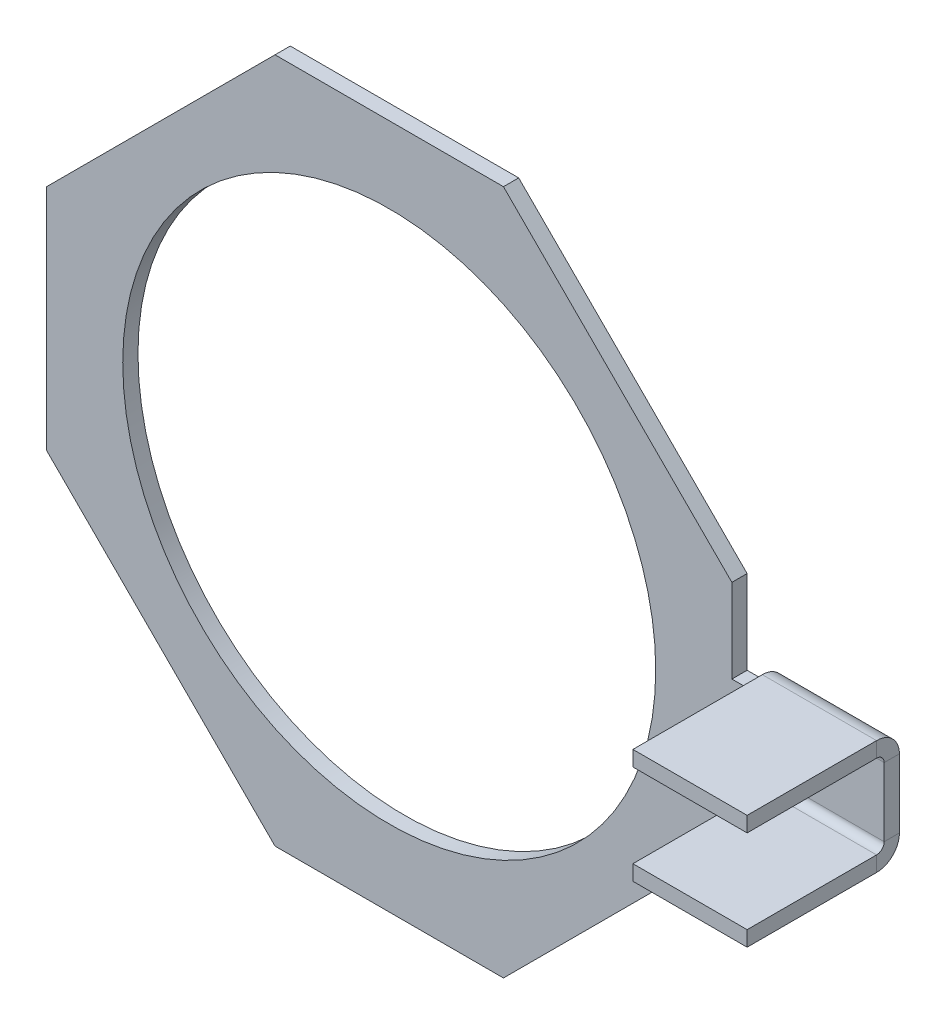
ISO-10303-21;
HEADER;
FILE_DESCRIPTION(('STEP AP214'),'2;1');
FILE_NAME('part.step','',(''),(''),'','','');
FILE_SCHEMA(('AUTOMOTIVE_DESIGN { 1 0 10303 214 1 1 1 1 }'));
ENDSEC;
DATA;
#1=APPLICATION_CONTEXT('core data for automotive mechanical design processes');
#2=APPLICATION_PROTOCOL_DEFINITION('international standard','automotive_design',2000,#1);
#3=PRODUCT_CONTEXT('',#1,'mechanical');
#4=PRODUCT('Part','Part','',(#3));
#5=PRODUCT_RELATED_PRODUCT_CATEGORY('part','',(#4));
#6=PRODUCT_DEFINITION_FORMATION('','',#4);
#7=PRODUCT_DEFINITION_CONTEXT('part definition',#1,'design');
#8=PRODUCT_DEFINITION('design','',#6,#7);
#9=PRODUCT_DEFINITION_SHAPE('','',#8);
#10=(LENGTH_UNIT() NAMED_UNIT(*) SI_UNIT(.MILLI.,.METRE.));
#11=(NAMED_UNIT(*) PLANE_ANGLE_UNIT() SI_UNIT($,.RADIAN.));
#12=(NAMED_UNIT(*) SI_UNIT($,.STERADIAN.) SOLID_ANGLE_UNIT());
#13=UNCERTAINTY_MEASURE_WITH_UNIT(LENGTH_MEASURE(1.E-05),#10,'distance_accuracy_value','');
#14=(GEOMETRIC_REPRESENTATION_CONTEXT(3) GLOBAL_UNCERTAINTY_ASSIGNED_CONTEXT((#13)) GLOBAL_UNIT_ASSIGNED_CONTEXT((#10,
#11,#12)) REPRESENTATION_CONTEXT('',''));
#15=CARTESIAN_POINT('',(0.,0.,0.));
#16=DIRECTION('',(0.,0.,1.));
#17=DIRECTION('',(1.,0.,0.));
#18=AXIS2_PLACEMENT_3D('',#15,#16,#17);
#19=CARTESIAN_POINT('',(65.,-4.,2.));
#20=DIRECTION('',(0.,1.,0.));
#21=DIRECTION('',(0.,0.,1.));
#22=AXIS2_PLACEMENT_3D('',#19,#20,#21);
#23=PLANE('',#22);
#24=DIRECTION('',(0.,0.,-1.));
#25=VECTOR('',#24,1.);
#26=CARTESIAN_POINT('',(50.,-4.,2.));
#27=LINE('',#26,#25);
#28=CARTESIAN_POINT('',(50.,-4.,2.));
#29=VERTEX_POINT('',#28);
#30=CARTESIAN_POINT('',(50.,-4.,0.));
#31=VERTEX_POINT('',#30);
#32=EDGE_CURVE('E352',#29,#31,#27,.T.);
#33=ORIENTED_EDGE('',*,*,#32,.F.);
#34=DIRECTION('',(-1.,0.,0.));
#35=VECTOR('',#34,1.);
#36=CARTESIAN_POINT('',(65.,-4.,2.));
#37=LINE('',#36,#35);
#38=CARTESIAN_POINT('',(45.,-4.,2.));
#39=VERTEX_POINT('',#38);
#40=EDGE_CURVE('E98',#29,#39,#37,.T.);
#41=ORIENTED_EDGE('',*,*,#40,.T.);
#42=DIRECTION('',(0.,0.,-1.));
#43=VECTOR('',#42,1.);
#44=CARTESIAN_POINT('',(45.,-4.,2.));
#45=LINE('',#44,#43);
#46=CARTESIAN_POINT('',(45.,-4.,0.));
#47=VERTEX_POINT('',#46);
#48=EDGE_CURVE('E371',#39,#47,#45,.T.);
#49=ORIENTED_EDGE('',*,*,#48,.T.);
#50=DIRECTION('',(-1.,0.,0.));
#51=VECTOR('',#50,1.);
#52=CARTESIAN_POINT('',(65.,-4.,0.));
#53=LINE('',#52,#51);
#54=EDGE_CURVE('E393',#31,#47,#53,.T.);
#55=ORIENTED_EDGE('',*,*,#54,.F.);
#56=EDGE_LOOP('',(#33,#41,#49,#55));
#57=FACE_BOUND('',#56,.T.);
#58=ADVANCED_FACE('F73',(#57),#23,.F.);
#59=CARTESIAN_POINT('',(45.,-15.,2.));
#60=DIRECTION('',(-1.,0.,0.));
#61=DIRECTION('',(0.,0.,1.));
#62=AXIS2_PLACEMENT_3D('',#59,#60,#61);
#63=PLANE('',#62);
#64=DIRECTION('',(0.,0.,1.));
#65=VECTOR('',#64,1.);
#66=CARTESIAN_POINT('',(45.,4.,2.));
#67=LINE('',#66,#65);
#68=CARTESIAN_POINT('',(45.,4.,0.));
#69=VERTEX_POINT('',#68);
#70=CARTESIAN_POINT('',(45.,4.,2.));
#71=VERTEX_POINT('',#70);
#72=EDGE_CURVE('E375',#69,#71,#67,.T.);
#73=ORIENTED_EDGE('',*,*,#72,.F.);
#74=DIRECTION('',(0.,1.,0.));
#75=VECTOR('',#74,1.);
#76=CARTESIAN_POINT('',(45.,-15.,0.));
#77=LINE('',#76,#75);
#78=CARTESIAN_POINT('',(45.,15.,0.));
#79=VERTEX_POINT('',#78);
#80=EDGE_CURVE('E411',#69,#79,#77,.T.);
#81=ORIENTED_EDGE('',*,*,#80,.T.);
#82=DIRECTION('',(0.,0.,-1.));
#83=VECTOR('',#82,1.);
#84=CARTESIAN_POINT('',(45.,15.,2.));
#85=LINE('',#84,#83);
#86=CARTESIAN_POINT('',(45.,15.,2.));
#87=VERTEX_POINT('',#86);
#88=EDGE_CURVE('E449',#87,#79,#85,.T.);
#89=ORIENTED_EDGE('',*,*,#88,.F.);
#90=DIRECTION('',(0.,1.,0.));
#91=VECTOR('',#90,1.);
#92=CARTESIAN_POINT('',(45.,-15.,2.));
#93=LINE('',#92,#91);
#94=EDGE_CURVE('E385',#71,#87,#93,.T.);
#95=ORIENTED_EDGE('',*,*,#94,.F.);
#96=EDGE_LOOP('',(#73,#81,#89,#95));
#97=FACE_BOUND('',#96,.T.);
#98=ADVANCED_FACE('F409',(#97),#63,.F.);
#99=ORIENTED_EDGE('',*,*,#48,.F.);
#100=CARTESIAN_POINT('',(45.,-15.,2.));
#101=VERTEX_POINT('',#100);
#102=EDGE_CURVE('E428',#101,#39,#93,.T.);
#103=ORIENTED_EDGE('',*,*,#102,.F.);
#104=DIRECTION('',(0.,0.,-1.));
#105=VECTOR('',#104,1.);
#106=CARTESIAN_POINT('',(45.,-15.,2.));
#107=LINE('',#106,#105);
#108=CARTESIAN_POINT('',(45.,-15.,0.));
#109=VERTEX_POINT('',#108);
#110=EDGE_CURVE('E451',#101,#109,#107,.T.);
#111=ORIENTED_EDGE('',*,*,#110,.T.);
#112=EDGE_CURVE('E420',#109,#47,#77,.T.);
#113=ORIENTED_EDGE('',*,*,#112,.T.);
#114=EDGE_LOOP('',(#99,#103,#111,#113));
#115=FACE_BOUND('',#114,.T.);
#116=ADVANCED_FACE('F499',(#115),#63,.F.);
#117=CARTESIAN_POINT('',(-45.,-15.,2.));
#118=DIRECTION('',(1.,0.,0.));
#119=DIRECTION('',(0.,0.,-1.));
#120=AXIS2_PLACEMENT_3D('',#117,#118,#119);
#121=PLANE('',#120);
#122=DIRECTION('',(0.,-1.,0.));
#123=VECTOR('',#122,1.);
#124=CARTESIAN_POINT('',(-45.,-15.,0.));
#125=LINE('',#124,#123);
#126=CARTESIAN_POINT('',(-45.,15.,0.));
#127=VERTEX_POINT('',#126);
#128=CARTESIAN_POINT('',(-45.,-15.,0.));
#129=VERTEX_POINT('',#128);
#130=EDGE_CURVE('E400',#127,#129,#125,.T.);
#131=ORIENTED_EDGE('',*,*,#130,.T.);
#132=DIRECTION('',(0.,0.,-1.));
#133=VECTOR('',#132,1.);
#134=CARTESIAN_POINT('',(-45.,-15.,2.));
#135=LINE('',#134,#133);
#136=CARTESIAN_POINT('',(-45.,-15.,2.));
#137=VERTEX_POINT('',#136);
#138=EDGE_CURVE('E13',#137,#129,#135,.T.);
#139=ORIENTED_EDGE('',*,*,#138,.F.);
#140=DIRECTION('',(0.,-1.,0.));
#141=VECTOR('',#140,1.);
#142=CARTESIAN_POINT('',(-45.,-15.,2.));
#143=LINE('',#142,#141);
#144=CARTESIAN_POINT('',(-45.,15.,2.));
#145=VERTEX_POINT('',#144);
#146=EDGE_CURVE('E438',#145,#137,#143,.T.);
#147=ORIENTED_EDGE('',*,*,#146,.F.);
#148=DIRECTION('',(0.,0.,-1.));
#149=VECTOR('',#148,1.);
#150=CARTESIAN_POINT('',(-45.,15.,2.));
#151=LINE('',#150,#149);
#152=EDGE_CURVE('E439',#145,#127,#151,.T.);
#153=ORIENTED_EDGE('',*,*,#152,.T.);
#154=EDGE_LOOP('',(#131,#139,#147,#153));
#155=FACE_BOUND('',#154,.T.);
#156=ADVANCED_FACE('F75',(#155),#121,.F.);
#157=CARTESIAN_POINT('',(-45.,-15.,2.));
#158=DIRECTION('',(0.707106781186547,0.707106781186547,0.));
#159=DIRECTION('',(-0.707106781186548,0.707106781186548,0.));
#160=AXIS2_PLACEMENT_3D('',#157,#158,#159);
#161=PLANE('',#160);
#162=DIRECTION('',(0.707106781186547,-0.707106781186547,0.));
#163=VECTOR('',#162,1.);
#164=CARTESIAN_POINT('',(-45.,-15.,0.));
#165=LINE('',#164,#163);
#166=CARTESIAN_POINT('',(-15.,-45.,0.));
#167=VERTEX_POINT('',#166);
#168=EDGE_CURVE('E467',#129,#167,#165,.T.);
#169=ORIENTED_EDGE('',*,*,#168,.T.);
#170=DIRECTION('',(0.,0.,-1.));
#171=VECTOR('',#170,1.);
#172=CARTESIAN_POINT('',(-15.,-45.,2.));
#173=LINE('',#172,#171);
#174=CARTESIAN_POINT('',(-15.,-45.,2.));
#175=VERTEX_POINT('',#174);
#176=EDGE_CURVE('E82',#175,#167,#173,.T.);
#177=ORIENTED_EDGE('',*,*,#176,.F.);
#178=DIRECTION('',(0.707106781186547,-0.707106781186547,0.));
#179=VECTOR('',#178,1.);
#180=CARTESIAN_POINT('',(-45.,-15.,2.));
#181=LINE('',#180,#179);
#182=EDGE_CURVE('E483',#137,#175,#181,.T.);
#183=ORIENTED_EDGE('',*,*,#182,.F.);
#184=ORIENTED_EDGE('',*,*,#138,.T.);
#185=EDGE_LOOP('',(#169,#177,#183,#184));
#186=FACE_BOUND('',#185,.T.);
#187=ADVANCED_FACE('F491',(#186),#161,.F.);
#188=CARTESIAN_POINT('',(-15.,-45.,2.));
#189=DIRECTION('',(0.,1.,0.));
#190=DIRECTION('',(-1.,0.,0.));
#191=AXIS2_PLACEMENT_3D('',#188,#189,#190);
#192=PLANE('',#191);
#193=DIRECTION('',(1.,0.,0.));
#194=VECTOR('',#193,1.);
#195=CARTESIAN_POINT('',(-15.,-45.,0.));
#196=LINE('',#195,#194);
#197=CARTESIAN_POINT('',(15.,-45.,0.));
#198=VERTEX_POINT('',#197);
#199=EDGE_CURVE('E425',#167,#198,#196,.T.);
#200=ORIENTED_EDGE('',*,*,#199,.T.);
#201=DIRECTION('',(0.,0.,-1.));
#202=VECTOR('',#201,1.);
#203=CARTESIAN_POINT('',(15.,-45.,2.));
#204=LINE('',#203,#202);
#205=CARTESIAN_POINT('',(15.,-45.,2.));
#206=VERTEX_POINT('',#205);
#207=EDGE_CURVE('E454',#206,#198,#204,.T.);
#208=ORIENTED_EDGE('',*,*,#207,.F.);
#209=DIRECTION('',(1.,0.,0.));
#210=VECTOR('',#209,1.);
#211=CARTESIAN_POINT('',(-15.,-45.,2.));
#212=LINE('',#211,#210);
#213=EDGE_CURVE('E464',#175,#206,#212,.T.);
#214=ORIENTED_EDGE('',*,*,#213,.F.);
#215=ORIENTED_EDGE('',*,*,#176,.T.);
#216=EDGE_LOOP('',(#200,#208,#214,#215));
#217=FACE_BOUND('',#216,.T.);
#218=ADVANCED_FACE('F462',(#217),#192,.F.);
#219=CARTESIAN_POINT('',(15.,-45.,2.));
#220=DIRECTION('',(-0.707106781186547,0.707106781186548,0.));
#221=DIRECTION('',(-0.707106781186548,-0.707106781186547,0.));
#222=AXIS2_PLACEMENT_3D('',#219,#220,#221);
#223=PLANE('',#222);
#224=DIRECTION('',(0.707106781186548,0.707106781186547,0.));
#225=VECTOR('',#224,1.);
#226=CARTESIAN_POINT('',(15.,-45.,0.));
#227=LINE('',#226,#225);
#228=EDGE_CURVE('E421',#198,#109,#227,.T.);
#229=ORIENTED_EDGE('',*,*,#228,.T.);
#230=ORIENTED_EDGE('',*,*,#110,.F.);
#231=DIRECTION('',(0.707106781186548,0.707106781186547,0.));
#232=VECTOR('',#231,1.);
#233=CARTESIAN_POINT('',(15.,-45.,2.));
#234=LINE('',#233,#232);
#235=EDGE_CURVE('E479',#206,#101,#234,.T.);
#236=ORIENTED_EDGE('',*,*,#235,.F.);
#237=ORIENTED_EDGE('',*,*,#207,.T.);
#238=EDGE_LOOP('',(#229,#230,#236,#237));
#239=FACE_BOUND('',#238,.T.);
#240=ADVANCED_FACE('F497',(#239),#223,.F.);
#241=CARTESIAN_POINT('',(15.,45.,2.));
#242=DIRECTION('',(-0.707106781186547,-0.707106781186548,0.));
#243=DIRECTION('',(0.707106781186548,-0.707106781186547,0.));
#244=AXIS2_PLACEMENT_3D('',#241,#242,#243);
#245=PLANE('',#244);
#246=DIRECTION('',(-0.707106781186548,0.707106781186547,0.));
#247=VECTOR('',#246,1.);
#248=CARTESIAN_POINT('',(15.,45.,0.));
#249=LINE('',#248,#247);
#250=CARTESIAN_POINT('',(15.,45.,0.));
#251=VERTEX_POINT('',#250);
#252=EDGE_CURVE('E419',#79,#251,#249,.T.);
#253=ORIENTED_EDGE('',*,*,#252,.T.);
#254=DIRECTION('',(0.,0.,-1.));
#255=VECTOR('',#254,1.);
#256=CARTESIAN_POINT('',(15.,45.,2.));
#257=LINE('',#256,#255);
#258=CARTESIAN_POINT('',(15.,45.,2.));
#259=VERTEX_POINT('',#258);
#260=EDGE_CURVE('E446',#259,#251,#257,.T.);
#261=ORIENTED_EDGE('',*,*,#260,.F.);
#262=DIRECTION('',(-0.707106781186548,0.707106781186547,0.));
#263=VECTOR('',#262,1.);
#264=CARTESIAN_POINT('',(15.,45.,2.));
#265=LINE('',#264,#263);
#266=EDGE_CURVE('E476',#87,#259,#265,.T.);
#267=ORIENTED_EDGE('',*,*,#266,.F.);
#268=ORIENTED_EDGE('',*,*,#88,.T.);
#269=EDGE_LOOP('',(#253,#261,#267,#268));
#270=FACE_BOUND('',#269,.T.);
#271=ADVANCED_FACE('F522',(#270),#245,.F.);
#272=CARTESIAN_POINT('',(-15.,45.,2.));
#273=DIRECTION('',(0.,-1.,0.));
#274=DIRECTION('',(1.,0.,0.));
#275=AXIS2_PLACEMENT_3D('',#272,#273,#274);
#276=PLANE('',#275);
#277=DIRECTION('',(-1.,0.,0.));
#278=VECTOR('',#277,1.);
#279=CARTESIAN_POINT('',(-15.,45.,0.));
#280=LINE('',#279,#278);
#281=CARTESIAN_POINT('',(-15.,45.,0.));
#282=VERTEX_POINT('',#281);
#283=EDGE_CURVE('E434',#251,#282,#280,.T.);
#284=ORIENTED_EDGE('',*,*,#283,.T.);
#285=DIRECTION('',(0.,0.,-1.));
#286=VECTOR('',#285,1.);
#287=CARTESIAN_POINT('',(-15.,45.,2.));
#288=LINE('',#287,#286);
#289=CARTESIAN_POINT('',(-15.,45.,2.));
#290=VERTEX_POINT('',#289);
#291=EDGE_CURVE('E442',#290,#282,#288,.T.);
#292=ORIENTED_EDGE('',*,*,#291,.F.);
#293=DIRECTION('',(-1.,0.,0.));
#294=VECTOR('',#293,1.);
#295=CARTESIAN_POINT('',(-15.,45.,2.));
#296=LINE('',#295,#294);
#297=EDGE_CURVE('E474',#259,#290,#296,.T.);
#298=ORIENTED_EDGE('',*,*,#297,.F.);
#299=ORIENTED_EDGE('',*,*,#260,.T.);
#300=EDGE_LOOP('',(#284,#292,#298,#299));
#301=FACE_BOUND('',#300,.T.);
#302=ADVANCED_FACE('F518',(#301),#276,.F.);
#303=CARTESIAN_POINT('',(-45.,15.,2.));
#304=DIRECTION('',(0.707106781186548,-0.707106781186547,0.));
#305=DIRECTION('',(0.707106781186547,0.707106781186548,0.));
#306=AXIS2_PLACEMENT_3D('',#303,#304,#305);
#307=PLANE('',#306);
#308=DIRECTION('',(-0.707106781186547,-0.707106781186548,0.));
#309=VECTOR('',#308,1.);
#310=CARTESIAN_POINT('',(-45.,15.,0.));
#311=LINE('',#310,#309);
#312=EDGE_CURVE('E436',#282,#127,#311,.T.);
#313=ORIENTED_EDGE('',*,*,#312,.T.);
#314=ORIENTED_EDGE('',*,*,#152,.F.);
#315=DIRECTION('',(-0.707106781186547,-0.707106781186548,0.));
#316=VECTOR('',#315,1.);
#317=CARTESIAN_POINT('',(-45.,15.,2.));
#318=LINE('',#317,#316);
#319=EDGE_CURVE('E443',#290,#145,#318,.T.);
#320=ORIENTED_EDGE('',*,*,#319,.F.);
#321=ORIENTED_EDGE('',*,*,#291,.T.);
#322=EDGE_LOOP('',(#313,#314,#320,#321));
#323=FACE_BOUND('',#322,.T.);
#324=ADVANCED_FACE('F511',(#323),#307,.F.);
#325=CARTESIAN_POINT('',(-45.,45.,2.));
#326=DIRECTION('',(0.,0.,-1.));
#327=DIRECTION('',(-1.,0.,0.));
#328=AXIS2_PLACEMENT_3D('',#325,#326,#327);
#329=PLANE('',#328);
#330=CARTESIAN_POINT('',(0.,0.,2.));
#331=DIRECTION('',(0.,0.,1.));
#332=DIRECTION('',(1.,0.,0.));
#333=AXIS2_PLACEMENT_3D('',#330,#331,#332);
#334=CIRCLE('',#333,35.);
#335=CARTESIAN_POINT('',(35.,0.,2.));
#336=VERTEX_POINT('',#335);
#337=EDGE_CURVE('E626',#336,#336,#334,.T.);
#338=ORIENTED_EDGE('',*,*,#337,.F.);
#339=EDGE_LOOP('',(#338));
#340=FACE_BOUND('',#339,.T.);
#341=ORIENTED_EDGE('',*,*,#146,.T.);
#342=ORIENTED_EDGE('',*,*,#182,.T.);
#343=ORIENTED_EDGE('',*,*,#213,.T.);
#344=ORIENTED_EDGE('',*,*,#235,.T.);
#345=ORIENTED_EDGE('',*,*,#102,.T.);
#346=ORIENTED_EDGE('',*,*,#40,.F.);
#347=DIRECTION('',(0.,1.,0.));
#348=VECTOR('',#347,1.);
#349=CARTESIAN_POINT('',(50.,-4.5,2.));
#350=LINE('',#349,#348);
#351=CARTESIAN_POINT('',(50.,-4.5,2.));
#352=VERTEX_POINT('',#351);
#353=EDGE_CURVE('E369',#352,#29,#350,.T.);
#354=ORIENTED_EDGE('',*,*,#353,.F.);
#355=DIRECTION('',(-1.,0.,0.));
#356=VECTOR('',#355,1.);
#357=CARTESIAN_POINT('',(65.,-4.5,2.));
#358=LINE('',#357,#356);
#359=CARTESIAN_POINT('',(65.,-4.5,2.));
#360=VERTEX_POINT('',#359);
#361=EDGE_CURVE('E356',#360,#352,#358,.T.);
#362=ORIENTED_EDGE('',*,*,#361,.F.);
#363=DIRECTION('',(0.,-1.,0.));
#364=VECTOR('',#363,1.);
#365=CARTESIAN_POINT('',(65.,4.,2.));
#366=LINE('',#365,#364);
#367=CARTESIAN_POINT('',(65.,4.5,2.));
#368=VERTEX_POINT('',#367);
#369=EDGE_CURVE('E372',#368,#360,#366,.T.);
#370=ORIENTED_EDGE('',*,*,#369,.F.);
#371=DIRECTION('',(-1.,0.,0.));
#372=VECTOR('',#371,1.);
#373=CARTESIAN_POINT('',(65.,4.5,2.));
#374=LINE('',#373,#372);
#375=CARTESIAN_POINT('',(50.,4.5,2.));
#376=VERTEX_POINT('',#375);
#377=EDGE_CURVE('E343',#368,#376,#374,.T.);
#378=ORIENTED_EDGE('',*,*,#377,.T.);
#379=DIRECTION('',(0.,-1.,0.));
#380=VECTOR('',#379,1.);
#381=CARTESIAN_POINT('',(50.,4.5,2.));
#382=LINE('',#381,#380);
#383=CARTESIAN_POINT('',(50.,4.,2.));
#384=VERTEX_POINT('',#383);
#385=EDGE_CURVE('E346',#376,#384,#382,.T.);
#386=ORIENTED_EDGE('',*,*,#385,.T.);
#387=DIRECTION('',(-1.,0.,0.));
#388=VECTOR('',#387,1.);
#389=CARTESIAN_POINT('',(65.,4.,2.));
#390=LINE('',#389,#388);
#391=EDGE_CURVE('E90',#384,#71,#390,.T.);
#392=ORIENTED_EDGE('',*,*,#391,.T.);
#393=ORIENTED_EDGE('',*,*,#94,.T.);
#394=ORIENTED_EDGE('',*,*,#266,.T.);
#395=ORIENTED_EDGE('',*,*,#297,.T.);
#396=ORIENTED_EDGE('',*,*,#319,.T.);
#397=EDGE_LOOP('',(#341,#342,#343,#344,#345,#346,#354,#362,#370,#378,#386,#392,#393,#394,#395,#396));
#398=FACE_BOUND('',#397,.T.);
#399=ADVANCED_FACE('F487',(#340,#398),#329,.F.);
#400=CARTESIAN_POINT('',(-45.,45.,0.));
#401=DIRECTION('',(0.,0.,-1.));
#402=DIRECTION('',(-1.,0.,0.));
#403=AXIS2_PLACEMENT_3D('',#400,#401,#402);
#404=PLANE('',#403);
#405=CARTESIAN_POINT('',(0.,0.,0.));
#406=DIRECTION('',(0.,0.,-1.));
#407=DIRECTION('',(-1.,0.,0.));
#408=AXIS2_PLACEMENT_3D('',#405,#406,#407);
#409=CIRCLE('',#408,35.);
#410=CARTESIAN_POINT('',(-35.,0.,0.));
#411=VERTEX_POINT('',#410);
#412=EDGE_CURVE('E77',#411,#411,#409,.T.);
#413=ORIENTED_EDGE('',*,*,#412,.F.);
#414=EDGE_LOOP('',(#413));
#415=FACE_BOUND('',#414,.T.);
#416=ORIENTED_EDGE('',*,*,#130,.F.);
#417=ORIENTED_EDGE('',*,*,#312,.F.);
#418=ORIENTED_EDGE('',*,*,#283,.F.);
#419=ORIENTED_EDGE('',*,*,#252,.F.);
#420=ORIENTED_EDGE('',*,*,#80,.F.);
#421=DIRECTION('',(-1.,0.,0.));
#422=VECTOR('',#421,1.);
#423=CARTESIAN_POINT('',(65.,4.,0.));
#424=LINE('',#423,#422);
#425=CARTESIAN_POINT('',(50.,4.,0.));
#426=VERTEX_POINT('',#425);
#427=EDGE_CURVE('E396',#426,#69,#424,.T.);
#428=ORIENTED_EDGE('',*,*,#427,.F.);
#429=DIRECTION('',(0.,-1.,0.));
#430=VECTOR('',#429,1.);
#431=CARTESIAN_POINT('',(50.,4.5,0.));
#432=LINE('',#431,#430);
#433=CARTESIAN_POINT('',(50.,4.5,0.));
#434=VERTEX_POINT('',#433);
#435=EDGE_CURVE('E350',#434,#426,#432,.T.);
#436=ORIENTED_EDGE('',*,*,#435,.F.);
#437=DIRECTION('',(1.,0.,0.));
#438=VECTOR('',#437,1.);
#439=CARTESIAN_POINT('',(65.,4.5,0.));
#440=LINE('',#439,#438);
#441=CARTESIAN_POINT('',(65.,4.5,0.));
#442=VERTEX_POINT('',#441);
#443=EDGE_CURVE('E337',#434,#442,#440,.T.);
#444=ORIENTED_EDGE('',*,*,#443,.T.);
#445=DIRECTION('',(0.,1.,0.));
#446=VECTOR('',#445,1.);
#447=CARTESIAN_POINT('',(65.,4.,0.));
#448=LINE('',#447,#446);
#449=CARTESIAN_POINT('',(65.,-4.5,0.));
#450=VERTEX_POINT('',#449);
#451=EDGE_CURVE('E374',#450,#442,#448,.T.);
#452=ORIENTED_EDGE('',*,*,#451,.F.);
#453=DIRECTION('',(1.,0.,0.));
#454=VECTOR('',#453,1.);
#455=CARTESIAN_POINT('',(65.,-4.5,0.));
#456=LINE('',#455,#454);
#457=CARTESIAN_POINT('',(50.,-4.5,0.));
#458=VERTEX_POINT('',#457);
#459=EDGE_CURVE('E362',#458,#450,#456,.T.);
#460=ORIENTED_EDGE('',*,*,#459,.F.);
#461=DIRECTION('',(0.,1.,0.));
#462=VECTOR('',#461,1.);
#463=CARTESIAN_POINT('',(50.,-4.5,0.));
#464=LINE('',#463,#462);
#465=EDGE_CURVE('E365',#458,#31,#464,.T.);
#466=ORIENTED_EDGE('',*,*,#465,.T.);
#467=ORIENTED_EDGE('',*,*,#54,.T.);
#468=ORIENTED_EDGE('',*,*,#112,.F.);
#469=ORIENTED_EDGE('',*,*,#228,.F.);
#470=ORIENTED_EDGE('',*,*,#199,.F.);
#471=ORIENTED_EDGE('',*,*,#168,.F.);
#472=EDGE_LOOP('',(#416,#417,#418,#419,#420,#428,#436,#444,#452,#460,#466,#467,#468,#469,#470,#471));
#473=FACE_BOUND('',#472,.T.);
#474=ADVANCED_FACE('F416',(#415,#473),#404,.T.);
#475=CARTESIAN_POINT('',(65.,4.,2.));
#476=DIRECTION('',(0.,-1.,0.));
#477=DIRECTION('',(0.,0.,-1.));
#478=AXIS2_PLACEMENT_3D('',#475,#476,#477);
#479=PLANE('',#478);
#480=ORIENTED_EDGE('',*,*,#391,.F.);
#481=DIRECTION('',(0.,0.,-1.));
#482=VECTOR('',#481,1.);
#483=CARTESIAN_POINT('',(50.,4.,2.));
#484=LINE('',#483,#482);
#485=EDGE_CURVE('E325',#384,#426,#484,.T.);
#486=ORIENTED_EDGE('',*,*,#485,.T.);
#487=ORIENTED_EDGE('',*,*,#427,.T.);
#488=ORIENTED_EDGE('',*,*,#72,.T.);
#489=EDGE_LOOP('',(#480,#486,#487,#488));
#490=FACE_BOUND('',#489,.T.);
#491=ADVANCED_FACE('F405',(#490),#479,.F.);
#492=CARTESIAN_POINT('',(65.,-4.,2.));
#493=DIRECTION('',(1.,0.,0.));
#494=DIRECTION('',(0.,0.,-1.));
#495=AXIS2_PLACEMENT_3D('',#492,#493,#494);
#496=PLANE('',#495);
#497=ORIENTED_EDGE('',*,*,#369,.T.);
#498=DIRECTION('',(0.,0.,1.));
#499=VECTOR('',#498,1.);
#500=CARTESIAN_POINT('',(65.,-4.5,2.));
#501=LINE('',#500,#499);
#502=EDGE_CURVE('E353',#450,#360,#501,.T.);
#503=ORIENTED_EDGE('',*,*,#502,.F.);
#504=ORIENTED_EDGE('',*,*,#451,.T.);
#505=DIRECTION('',(0.,0.,1.));
#506=VECTOR('',#505,1.);
#507=CARTESIAN_POINT('',(65.,4.5,2.));
#508=LINE('',#507,#506);
#509=EDGE_CURVE('E334',#442,#368,#508,.T.);
#510=ORIENTED_EDGE('',*,*,#509,.T.);
#511=EDGE_LOOP('',(#497,#503,#504,#510));
#512=FACE_BOUND('',#511,.T.);
#513=ADVANCED_FACE('F601',(#512),#496,.T.);
#514=CARTESIAN_POINT('',(50.,-4.5,2.));
#515=DIRECTION('',(1.,0.,0.));
#516=DIRECTION('',(0.,0.,-1.));
#517=AXIS2_PLACEMENT_3D('',#514,#515,#516);
#518=PLANE('',#517);
#519=ORIENTED_EDGE('',*,*,#32,.T.);
#520=ORIENTED_EDGE('',*,*,#465,.F.);
#521=DIRECTION('',(0.,0.,-1.));
#522=VECTOR('',#521,1.);
#523=CARTESIAN_POINT('',(50.,-4.5,2.));
#524=LINE('',#523,#522);
#525=EDGE_CURVE('E359',#352,#458,#524,.T.);
#526=ORIENTED_EDGE('',*,*,#525,.F.);
#527=ORIENTED_EDGE('',*,*,#353,.T.);
#528=EDGE_LOOP('',(#519,#520,#526,#527));
#529=FACE_BOUND('',#528,.T.);
#530=ADVANCED_FACE('F547',(#529),#518,.F.);
#531=CARTESIAN_POINT('',(50.,4.5,2.));
#532=DIRECTION('',(-1.,0.,0.));
#533=DIRECTION('',(0.,0.,1.));
#534=AXIS2_PLACEMENT_3D('',#531,#532,#533);
#535=PLANE('',#534);
#536=ORIENTED_EDGE('',*,*,#485,.F.);
#537=ORIENTED_EDGE('',*,*,#385,.F.);
#538=DIRECTION('',(0.,0.,-1.));
#539=VECTOR('',#538,1.);
#540=CARTESIAN_POINT('',(50.,4.5,2.));
#541=LINE('',#540,#539);
#542=EDGE_CURVE('E340',#376,#434,#541,.T.);
#543=ORIENTED_EDGE('',*,*,#542,.T.);
#544=ORIENTED_EDGE('',*,*,#435,.T.);
#545=EDGE_LOOP('',(#536,#537,#543,#544));
#546=FACE_BOUND('',#545,.T.);
#547=ADVANCED_FACE('F594',(#546),#535,.T.);
#548=CARTESIAN_POINT('',(50.,-4.5,3.));
#549=DIRECTION('',(-1.,0.,0.));
#550=DIRECTION('',(0.,0.,1.));
#551=AXIS2_PLACEMENT_3D('',#548,#549,#550);
#552=PLANE('',#551);
#553=DIRECTION('',(0.,1.,0.));
#554=VECTOR('',#553,1.);
#555=CARTESIAN_POINT('',(50.,-7.5,2.99999999999999));
#556=LINE('',#555,#554);
#557=CARTESIAN_POINT('',(50.,-5.5,2.99999999999999));
#558=VERTEX_POINT('',#557);
#559=CARTESIAN_POINT('',(50.,-7.5,2.99999999999999));
#560=VERTEX_POINT('',#559);
#561=EDGE_CURVE('E282',#558,#560,#556,.F.);
#562=ORIENTED_EDGE('',*,*,#561,.F.);
#563=CARTESIAN_POINT('',(50.,-4.5,3.));
#564=DIRECTION('',(1.,0.,0.));
#565=DIRECTION('',(0.,0.,-1.));
#566=AXIS2_PLACEMENT_3D('',#563,#564,#565);
#567=CIRCLE('',#566,1.);
#568=EDGE_CURVE('E329',#352,#558,#567,.F.);
#569=ORIENTED_EDGE('',*,*,#568,.F.);
#570=ORIENTED_EDGE('',*,*,#525,.T.);
#571=CARTESIAN_POINT('',(50.,-4.5,3.));
#572=DIRECTION('',(1.,0.,0.));
#573=DIRECTION('',(0.,0.,-1.));
#574=AXIS2_PLACEMENT_3D('',#571,#572,#573);
#575=CIRCLE('',#574,3.);
#576=EDGE_CURVE('E322',#458,#560,#575,.F.);
#577=ORIENTED_EDGE('',*,*,#576,.T.);
#578=EDGE_LOOP('',(#562,#569,#570,#577));
#579=FACE_BOUND('',#578,.T.);
#580=ADVANCED_FACE('F555',(#579),#552,.T.);
#581=CARTESIAN_POINT('',(65.,-4.5,3.));
#582=DIRECTION('',(-1.,0.,0.));
#583=DIRECTION('',(0.,0.,1.));
#584=AXIS2_PLACEMENT_3D('',#581,#582,#583);
#585=PLANE('',#584);
#586=CARTESIAN_POINT('',(65.,-4.5,3.));
#587=DIRECTION('',(1.,0.,0.));
#588=DIRECTION('',(0.,0.,-1.));
#589=AXIS2_PLACEMENT_3D('',#586,#587,#588);
#590=CIRCLE('',#589,1.);
#591=CARTESIAN_POINT('',(65.,-5.5,3.));
#592=VERTEX_POINT('',#591);
#593=EDGE_CURVE('E295',#592,#360,#590,.T.);
#594=ORIENTED_EDGE('',*,*,#593,.F.);
#595=DIRECTION('',(0.,1.,0.));
#596=VECTOR('',#595,1.);
#597=CARTESIAN_POINT('',(65.,-5.5,3.));
#598=LINE('',#597,#596);
#599=CARTESIAN_POINT('',(65.,-7.5,2.99999999999999));
#600=VERTEX_POINT('',#599);
#601=EDGE_CURVE('E315',#592,#600,#598,.F.);
#602=ORIENTED_EDGE('',*,*,#601,.T.);
#603=CARTESIAN_POINT('',(65.,-4.5,3.));
#604=DIRECTION('',(1.,0.,0.));
#605=DIRECTION('',(0.,0.,-1.));
#606=AXIS2_PLACEMENT_3D('',#603,#604,#605);
#607=CIRCLE('',#606,3.);
#608=EDGE_CURVE('E326',#600,#450,#607,.T.);
#609=ORIENTED_EDGE('',*,*,#608,.T.);
#610=ORIENTED_EDGE('',*,*,#502,.T.);
#611=EDGE_LOOP('',(#594,#602,#609,#610));
#612=FACE_BOUND('',#611,.T.);
#613=ADVANCED_FACE('F575',(#612),#585,.F.);
#614=CARTESIAN_POINT('',(65.,-4.5,3.));
#615=DIRECTION('',(1.,0.,0.));
#616=DIRECTION('',(0.,-1.,0.));
#617=AXIS2_PLACEMENT_3D('',#614,#615,#616);
#618=CYLINDRICAL_SURFACE('',#617,3.);
#619=ORIENTED_EDGE('',*,*,#459,.T.);
#620=ORIENTED_EDGE('',*,*,#608,.F.);
#621=DIRECTION('',(1.,0.,0.));
#622=VECTOR('',#621,1.);
#623=CARTESIAN_POINT('',(50.,-7.5,2.99999999999999));
#624=LINE('',#623,#622);
#625=EDGE_CURVE('E313',#600,#560,#624,.F.);
#626=ORIENTED_EDGE('',*,*,#625,.T.);
#627=ORIENTED_EDGE('',*,*,#576,.F.);
#628=EDGE_LOOP('',(#619,#620,#626,#627));
#629=FACE_BOUND('',#628,.T.);
#630=ADVANCED_FACE('F585',(#629),#618,.T.);
#631=CARTESIAN_POINT('',(65.,-4.5,3.));
#632=DIRECTION('',(1.,0.,0.));
#633=DIRECTION('',(0.,-1.,0.));
#634=AXIS2_PLACEMENT_3D('',#631,#632,#633);
#635=CYLINDRICAL_SURFACE('',#634,1.);
#636=ORIENTED_EDGE('',*,*,#361,.T.);
#637=ORIENTED_EDGE('',*,*,#568,.T.);
#638=DIRECTION('',(1.,0.,0.));
#639=VECTOR('',#638,1.);
#640=CARTESIAN_POINT('',(50.,-5.5,2.99999999999999));
#641=LINE('',#640,#639);
#642=EDGE_CURVE('E318',#558,#592,#641,.T.);
#643=ORIENTED_EDGE('',*,*,#642,.T.);
#644=ORIENTED_EDGE('',*,*,#593,.T.);
#645=EDGE_LOOP('',(#636,#637,#643,#644));
#646=FACE_BOUND('',#645,.T.);
#647=ADVANCED_FACE('F552',(#646),#635,.F.);
#648=CARTESIAN_POINT('',(65.,-7.50000000000006,20.));
#649=DIRECTION('',(-1.,0.,0.));
#650=DIRECTION('',(0.,-1.,0.));
#651=AXIS2_PLACEMENT_3D('',#648,#649,#650);
#652=PLANE('',#651);
#653=ORIENTED_EDGE('',*,*,#601,.F.);
#654=DIRECTION('',(0.,0.,-1.));
#655=VECTOR('',#654,1.);
#656=CARTESIAN_POINT('',(65.,-5.50000000000006,20.));
#657=LINE('',#656,#655);
#658=CARTESIAN_POINT('',(65.,-5.50000000000006,20.));
#659=VERTEX_POINT('',#658);
#660=EDGE_CURVE('E311',#592,#659,#657,.F.);
#661=ORIENTED_EDGE('',*,*,#660,.T.);
#662=DIRECTION('',(0.,1.,0.));
#663=VECTOR('',#662,1.);
#664=CARTESIAN_POINT('',(65.,-7.50000000000006,20.));
#665=LINE('',#664,#663);
#666=CARTESIAN_POINT('',(65.,-7.50000000000006,20.));
#667=VERTEX_POINT('',#666);
#668=EDGE_CURVE('E292',#667,#659,#665,.T.);
#669=ORIENTED_EDGE('',*,*,#668,.F.);
#670=DIRECTION('',(0.,0.,1.));
#671=VECTOR('',#670,1.);
#672=CARTESIAN_POINT('',(65.,-7.5,1.99999999999999));
#673=LINE('',#672,#671);
#674=EDGE_CURVE('E304',#600,#667,#673,.T.);
#675=ORIENTED_EDGE('',*,*,#674,.F.);
#676=EDGE_LOOP('',(#653,#661,#669,#675));
#677=FACE_BOUND('',#676,.T.);
#678=ADVANCED_FACE('F577',(#677),#652,.F.);
#679=CARTESIAN_POINT('',(50.,-7.5,1.99999999999999));
#680=DIRECTION('',(1.,0.,0.));
#681=DIRECTION('',(0.,1.,0.));
#682=AXIS2_PLACEMENT_3D('',#679,#680,#681);
#683=PLANE('',#682);
#684=ORIENTED_EDGE('',*,*,#561,.T.);
#685=DIRECTION('',(0.,0.,-1.));
#686=VECTOR('',#685,1.);
#687=CARTESIAN_POINT('',(50.,-7.5,1.99999999999999));
#688=LINE('',#687,#686);
#689=CARTESIAN_POINT('',(50.,-7.50000000000006,20.));
#690=VERTEX_POINT('',#689);
#691=EDGE_CURVE('E299',#690,#560,#688,.T.);
#692=ORIENTED_EDGE('',*,*,#691,.F.);
#693=DIRECTION('',(0.,1.,0.));
#694=VECTOR('',#693,1.);
#695=CARTESIAN_POINT('',(50.,-7.50000000000006,20.));
#696=LINE('',#695,#694);
#697=CARTESIAN_POINT('',(50.,-5.50000000000006,20.));
#698=VERTEX_POINT('',#697);
#699=EDGE_CURVE('E296',#690,#698,#696,.T.);
#700=ORIENTED_EDGE('',*,*,#699,.T.);
#701=DIRECTION('',(0.,0.,1.));
#702=VECTOR('',#701,1.);
#703=CARTESIAN_POINT('',(50.,-5.5,2.));
#704=LINE('',#703,#702);
#705=EDGE_CURVE('E306',#698,#558,#704,.F.);
#706=ORIENTED_EDGE('',*,*,#705,.T.);
#707=EDGE_LOOP('',(#684,#692,#700,#706));
#708=FACE_BOUND('',#707,.T.);
#709=ADVANCED_FACE('F558',(#708),#683,.F.);
#710=CARTESIAN_POINT('',(50.,-7.5,1.99999999999999));
#711=DIRECTION('',(0.,1.,0.));
#712=DIRECTION('',(0.,0.,1.));
#713=AXIS2_PLACEMENT_3D('',#710,#711,#712);
#714=PLANE('',#713);
#715=ORIENTED_EDGE('',*,*,#625,.F.);
#716=ORIENTED_EDGE('',*,*,#674,.T.);
#717=DIRECTION('',(-1.,0.,0.));
#718=VECTOR('',#717,1.);
#719=CARTESIAN_POINT('',(50.,-7.50000000000006,20.));
#720=LINE('',#719,#718);
#721=EDGE_CURVE('E302',#667,#690,#720,.T.);
#722=ORIENTED_EDGE('',*,*,#721,.T.);
#723=ORIENTED_EDGE('',*,*,#691,.T.);
#724=EDGE_LOOP('',(#715,#716,#722,#723));
#725=FACE_BOUND('',#724,.T.);
#726=ADVANCED_FACE('F562',(#725),#714,.F.);
#727=CARTESIAN_POINT('',(50.,-5.5,2.));
#728=DIRECTION('',(0.,1.,0.));
#729=DIRECTION('',(0.,0.,1.));
#730=AXIS2_PLACEMENT_3D('',#727,#728,#729);
#731=PLANE('',#730);
#732=ORIENTED_EDGE('',*,*,#660,.F.);
#733=ORIENTED_EDGE('',*,*,#642,.F.);
#734=ORIENTED_EDGE('',*,*,#705,.F.);
#735=DIRECTION('',(1.,0.,0.));
#736=VECTOR('',#735,1.);
#737=CARTESIAN_POINT('',(50.,-5.50000000000006,20.));
#738=LINE('',#737,#736);
#739=EDGE_CURVE('E309',#659,#698,#738,.F.);
#740=ORIENTED_EDGE('',*,*,#739,.F.);
#741=EDGE_LOOP('',(#732,#733,#734,#740));
#742=FACE_BOUND('',#741,.T.);
#743=ADVANCED_FACE('F572',(#742),#731,.T.);
#744=CARTESIAN_POINT('',(50.,-7.50000000000006,20.));
#745=DIRECTION('',(0.,0.,-1.));
#746=DIRECTION('',(0.,1.,0.));
#747=AXIS2_PLACEMENT_3D('',#744,#745,#746);
#748=PLANE('',#747);
#749=ORIENTED_EDGE('',*,*,#739,.T.);
#750=ORIENTED_EDGE('',*,*,#699,.F.);
#751=ORIENTED_EDGE('',*,*,#721,.F.);
#752=ORIENTED_EDGE('',*,*,#668,.T.);
#753=EDGE_LOOP('',(#749,#750,#751,#752));
#754=FACE_BOUND('',#753,.T.);
#755=ADVANCED_FACE('F568',(#754),#748,.F.);
#756=CARTESIAN_POINT('',(65.,4.5,3.));
#757=DIRECTION('',(1.,0.,0.));
#758=DIRECTION('',(0.,0.,-1.));
#759=AXIS2_PLACEMENT_3D('',#756,#757,#758);
#760=PLANE('',#759);
#761=DIRECTION('',(0.,1.,0.));
#762=VECTOR('',#761,1.);
#763=CARTESIAN_POINT('',(65.,7.5,2.99999999999999));
#764=LINE('',#763,#762);
#765=CARTESIAN_POINT('',(65.,5.5,3.));
#766=VERTEX_POINT('',#765);
#767=CARTESIAN_POINT('',(65.,7.5,2.99999999999999));
#768=VERTEX_POINT('',#767);
#769=EDGE_CURVE('E245',#766,#768,#764,.T.);
#770=ORIENTED_EDGE('',*,*,#769,.F.);
#771=CARTESIAN_POINT('',(65.,4.5,3.));
#772=DIRECTION('',(-1.,0.,0.));
#773=DIRECTION('',(0.,0.,1.));
#774=AXIS2_PLACEMENT_3D('',#771,#772,#773);
#775=CIRCLE('',#774,1.);
#776=EDGE_CURVE('E286',#368,#766,#775,.F.);
#777=ORIENTED_EDGE('',*,*,#776,.F.);
#778=ORIENTED_EDGE('',*,*,#509,.F.);
#779=CARTESIAN_POINT('',(65.,4.5,3.));
#780=DIRECTION('',(-1.,0.,0.));
#781=DIRECTION('',(0.,0.,1.));
#782=AXIS2_PLACEMENT_3D('',#779,#780,#781);
#783=CIRCLE('',#782,3.);
#784=EDGE_CURVE('E279',#442,#768,#783,.F.);
#785=ORIENTED_EDGE('',*,*,#784,.T.);
#786=EDGE_LOOP('',(#770,#777,#778,#785));
#787=FACE_BOUND('',#786,.T.);
#788=ADVANCED_FACE('F617',(#787),#760,.T.);
#789=CARTESIAN_POINT('',(50.,4.5,3.));
#790=DIRECTION('',(1.,0.,0.));
#791=DIRECTION('',(0.,0.,-1.));
#792=AXIS2_PLACEMENT_3D('',#789,#790,#791);
#793=PLANE('',#792);
#794=CARTESIAN_POINT('',(50.,4.5,3.));
#795=DIRECTION('',(-1.,0.,0.));
#796=DIRECTION('',(0.,0.,1.));
#797=AXIS2_PLACEMENT_3D('',#794,#795,#796);
#798=CIRCLE('',#797,1.);
#799=CARTESIAN_POINT('',(50.,5.5,2.99999999999999));
#800=VERTEX_POINT('',#799);
#801=EDGE_CURVE('E289',#800,#376,#798,.T.);
#802=ORIENTED_EDGE('',*,*,#801,.F.);
#803=DIRECTION('',(0.,1.,0.));
#804=VECTOR('',#803,1.);
#805=CARTESIAN_POINT('',(50.,5.5,2.99999999999999));
#806=LINE('',#805,#804);
#807=CARTESIAN_POINT('',(50.,7.5,2.99999999999999));
#808=VERTEX_POINT('',#807);
#809=EDGE_CURVE('E273',#800,#808,#806,.T.);
#810=ORIENTED_EDGE('',*,*,#809,.T.);
#811=CARTESIAN_POINT('',(50.,4.5,3.));
#812=DIRECTION('',(-1.,0.,0.));
#813=DIRECTION('',(0.,0.,1.));
#814=AXIS2_PLACEMENT_3D('',#811,#812,#813);
#815=CIRCLE('',#814,3.);
#816=EDGE_CURVE('E283',#808,#434,#815,.T.);
#817=ORIENTED_EDGE('',*,*,#816,.T.);
#818=ORIENTED_EDGE('',*,*,#542,.F.);
#819=EDGE_LOOP('',(#802,#810,#817,#818));
#820=FACE_BOUND('',#819,.T.);
#821=ADVANCED_FACE('F653',(#820),#793,.F.);
#822=CARTESIAN_POINT('',(50.,4.5,3.));
#823=DIRECTION('',(-1.,0.,0.));
#824=DIRECTION('',(0.,1.,0.));
#825=AXIS2_PLACEMENT_3D('',#822,#823,#824);
#826=CYLINDRICAL_SURFACE('',#825,3.);
#827=ORIENTED_EDGE('',*,*,#443,.F.);
#828=ORIENTED_EDGE('',*,*,#816,.F.);
#829=DIRECTION('',(-1.,0.,0.));
#830=VECTOR('',#829,1.);
#831=CARTESIAN_POINT('',(65.,7.5,2.99999999999999));
#832=LINE('',#831,#830);
#833=EDGE_CURVE('E271',#808,#768,#832,.F.);
#834=ORIENTED_EDGE('',*,*,#833,.T.);
#835=ORIENTED_EDGE('',*,*,#784,.F.);
#836=EDGE_LOOP('',(#827,#828,#834,#835));
#837=FACE_BOUND('',#836,.T.);
#838=ADVANCED_FACE('F619',(#837),#826,.T.);
#839=CARTESIAN_POINT('',(50.,4.5,3.));
#840=DIRECTION('',(-1.,0.,0.));
#841=DIRECTION('',(0.,1.,0.));
#842=AXIS2_PLACEMENT_3D('',#839,#840,#841);
#843=CYLINDRICAL_SURFACE('',#842,1.);
#844=ORIENTED_EDGE('',*,*,#377,.F.);
#845=ORIENTED_EDGE('',*,*,#776,.T.);
#846=DIRECTION('',(-1.,0.,0.));
#847=VECTOR('',#846,1.);
#848=CARTESIAN_POINT('',(65.,5.5,3.));
#849=LINE('',#848,#847);
#850=EDGE_CURVE('E276',#766,#800,#849,.T.);
#851=ORIENTED_EDGE('',*,*,#850,.T.);
#852=ORIENTED_EDGE('',*,*,#801,.T.);
#853=EDGE_LOOP('',(#844,#845,#851,#852));
#854=FACE_BOUND('',#853,.T.);
#855=ADVANCED_FACE('F613',(#854),#843,.F.);
#856=CARTESIAN_POINT('',(50.,7.5,1.99999999999999));
#857=DIRECTION('',(-1.,0.,0.));
#858=DIRECTION('',(0.,-1.,0.));
#859=AXIS2_PLACEMENT_3D('',#856,#857,#858);
#860=PLANE('',#859);
#861=DIRECTION('',(0.,0.,1.));
#862=VECTOR('',#861,1.);
#863=CARTESIAN_POINT('',(50.,7.5,1.99999999999999));
#864=LINE('',#863,#862);
#865=CARTESIAN_POINT('',(50.,7.50000000000006,20.));
#866=VERTEX_POINT('',#865);
#867=EDGE_CURVE('E261',#866,#808,#864,.F.);
#868=ORIENTED_EDGE('',*,*,#867,.T.);
#869=ORIENTED_EDGE('',*,*,#809,.F.);
#870=DIRECTION('',(0.,0.,-1.));
#871=VECTOR('',#870,1.);
#872=CARTESIAN_POINT('',(50.,5.5,2.));
#873=LINE('',#872,#871);
#874=CARTESIAN_POINT('',(50.,5.50000000000006,20.));
#875=VERTEX_POINT('',#874);
#876=EDGE_CURVE('E268',#875,#800,#873,.T.);
#877=ORIENTED_EDGE('',*,*,#876,.F.);
#878=DIRECTION('',(0.,-1.,0.));
#879=VECTOR('',#878,1.);
#880=CARTESIAN_POINT('',(50.,7.50000000000006,20.));
#881=LINE('',#880,#879);
#882=EDGE_CURVE('E256',#866,#875,#881,.T.);
#883=ORIENTED_EDGE('',*,*,#882,.F.);
#884=EDGE_LOOP('',(#868,#869,#877,#883));
#885=FACE_BOUND('',#884,.T.);
#886=ADVANCED_FACE('F622',(#885),#860,.T.);
#887=CARTESIAN_POINT('',(65.,7.50000000000006,20.));
#888=DIRECTION('',(1.,0.,0.));
#889=DIRECTION('',(0.,1.,0.));
#890=AXIS2_PLACEMENT_3D('',#887,#888,#889);
#891=PLANE('',#890);
#892=DIRECTION('',(0.,0.,1.));
#893=VECTOR('',#892,1.);
#894=CARTESIAN_POINT('',(65.,5.5,2.));
#895=LINE('',#894,#893);
#896=CARTESIAN_POINT('',(65.,5.50000000000006,20.));
#897=VERTEX_POINT('',#896);
#898=EDGE_CURVE('E263',#766,#897,#895,.T.);
#899=ORIENTED_EDGE('',*,*,#898,.F.);
#900=ORIENTED_EDGE('',*,*,#769,.T.);
#901=DIRECTION('',(0.,0.,-1.));
#902=VECTOR('',#901,1.);
#903=CARTESIAN_POINT('',(65.,7.50000000000006,20.));
#904=LINE('',#903,#902);
#905=CARTESIAN_POINT('',(65.,7.50000000000006,20.));
#906=VERTEX_POINT('',#905);
#907=EDGE_CURVE('E239',#768,#906,#904,.F.);
#908=ORIENTED_EDGE('',*,*,#907,.T.);
#909=DIRECTION('',(0.,-1.,0.));
#910=VECTOR('',#909,1.);
#911=CARTESIAN_POINT('',(65.,7.50000000000006,20.));
#912=LINE('',#911,#910);
#913=EDGE_CURVE('E243',#906,#897,#912,.T.);
#914=ORIENTED_EDGE('',*,*,#913,.T.);
#915=EDGE_LOOP('',(#899,#900,#908,#914));
#916=FACE_BOUND('',#915,.T.);
#917=ADVANCED_FACE('F242',(#916),#891,.T.);
#918=CARTESIAN_POINT('',(50.,7.5,1.99999999999999));
#919=DIRECTION('',(0.,-1.,0.));
#920=DIRECTION('',(0.,0.,1.));
#921=AXIS2_PLACEMENT_3D('',#918,#919,#920);
#922=PLANE('',#921);
#923=ORIENTED_EDGE('',*,*,#833,.F.);
#924=ORIENTED_EDGE('',*,*,#867,.F.);
#925=DIRECTION('',(1.,0.,0.));
#926=VECTOR('',#925,1.);
#927=CARTESIAN_POINT('',(50.,7.50000000000006,20.));
#928=LINE('',#927,#926);
#929=EDGE_CURVE('E249',#906,#866,#928,.F.);
#930=ORIENTED_EDGE('',*,*,#929,.F.);
#931=ORIENTED_EDGE('',*,*,#907,.F.);
#932=EDGE_LOOP('',(#923,#924,#930,#931));
#933=FACE_BOUND('',#932,.T.);
#934=ADVANCED_FACE('F259',(#933),#922,.F.);
#935=CARTESIAN_POINT('',(50.,5.5,2.));
#936=DIRECTION('',(0.,-1.,0.));
#937=DIRECTION('',(0.,0.,1.));
#938=AXIS2_PLACEMENT_3D('',#935,#936,#937);
#939=PLANE('',#938);
#940=ORIENTED_EDGE('',*,*,#876,.T.);
#941=ORIENTED_EDGE('',*,*,#850,.F.);
#942=ORIENTED_EDGE('',*,*,#898,.T.);
#943=DIRECTION('',(-1.,0.,0.));
#944=VECTOR('',#943,1.);
#945=CARTESIAN_POINT('',(50.,5.50000000000006,20.));
#946=LINE('',#945,#944);
#947=EDGE_CURVE('E255',#897,#875,#946,.T.);
#948=ORIENTED_EDGE('',*,*,#947,.T.);
#949=EDGE_LOOP('',(#940,#941,#942,#948));
#950=FACE_BOUND('',#949,.T.);
#951=ADVANCED_FACE('F639',(#950),#939,.T.);
#952=CARTESIAN_POINT('',(50.,7.50000000000006,20.));
#953=DIRECTION('',(0.,0.,1.));
#954=DIRECTION('',(0.,-1.,0.));
#955=AXIS2_PLACEMENT_3D('',#952,#953,#954);
#956=PLANE('',#955);
#957=ORIENTED_EDGE('',*,*,#947,.F.);
#958=ORIENTED_EDGE('',*,*,#913,.F.);
#959=ORIENTED_EDGE('',*,*,#929,.T.);
#960=ORIENTED_EDGE('',*,*,#882,.T.);
#961=EDGE_LOOP('',(#957,#958,#959,#960));
#962=FACE_BOUND('',#961,.T.);
#963=ADVANCED_FACE('F253',(#962),#956,.T.);
#964=CARTESIAN_POINT('',(0.,0.,-5.00000000001367E-05));
#965=DIRECTION('',(0.,0.,1.));
#966=DIRECTION('',(1.,0.,0.));
#967=AXIS2_PLACEMENT_3D('',#964,#965,#966);
#968=CYLINDRICAL_SURFACE('',#967,35.);
#969=ORIENTED_EDGE('',*,*,#412,.T.);
#970=EDGE_LOOP('',(#969));
#971=FACE_BOUND('',#970,.T.);
#972=ORIENTED_EDGE('',*,*,#337,.T.);
#973=EDGE_LOOP('',(#972));
#974=FACE_BOUND('',#973,.T.);
#975=ADVANCED_FACE('F633',(#971,#974),#968,.F.);
#976=CLOSED_SHELL('',(#58,#98,#116,#156,#187,#218,#240,#271,#302,#324,#399,#474,#491,#513,#530,
#547,#580,#613,#630,#647,#678,#709,#726,#743,#755,#788,#821,#838,#855,#886,#917,#934,#951,#963,#975));
#977=MANIFOLD_SOLID_BREP('B2',#976);
#978=ADVANCED_BREP_SHAPE_REPRESENTATION('',(#18,#977),#14);
#979=SHAPE_DEFINITION_REPRESENTATION(#9,#978);
ENDSEC;
END-ISO-10303-21;
